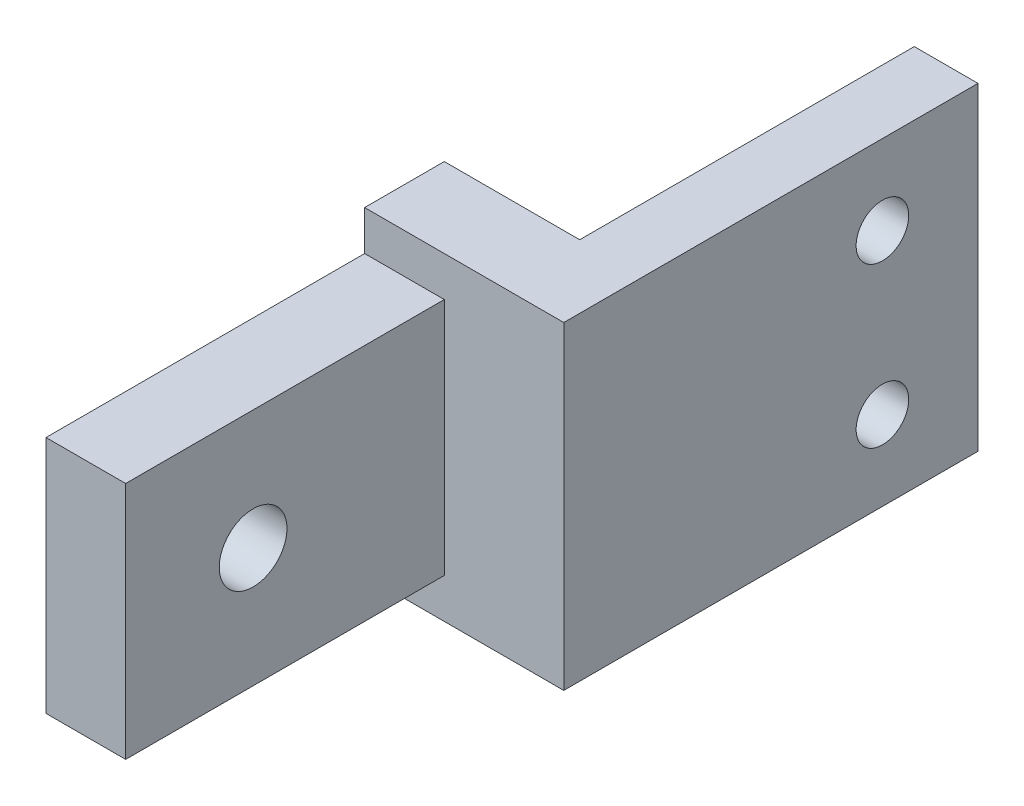
ISO-10303-21;
HEADER;
FILE_DESCRIPTION(('STEP AP214'),'2;1');
FILE_NAME('part.step','',(''),(''),'','','');
FILE_SCHEMA(('AUTOMOTIVE_DESIGN { 1 0 10303 214 1 1 1 1 }'));
ENDSEC;
DATA;
#1=APPLICATION_CONTEXT('core data for automotive mechanical design processes');
#2=APPLICATION_PROTOCOL_DEFINITION('international standard','automotive_design',2000,#1);
#3=PRODUCT_CONTEXT('',#1,'mechanical');
#4=PRODUCT('Part','Part','',(#3));
#5=PRODUCT_RELATED_PRODUCT_CATEGORY('part','',(#4));
#6=PRODUCT_DEFINITION_FORMATION('','',#4);
#7=PRODUCT_DEFINITION_CONTEXT('part definition',#1,'design');
#8=PRODUCT_DEFINITION('design','',#6,#7);
#9=PRODUCT_DEFINITION_SHAPE('','',#8);
#10=(LENGTH_UNIT() NAMED_UNIT(*) SI_UNIT(.MILLI.,.METRE.));
#11=(NAMED_UNIT(*) PLANE_ANGLE_UNIT() SI_UNIT($,.RADIAN.));
#12=(NAMED_UNIT(*) SI_UNIT($,.STERADIAN.) SOLID_ANGLE_UNIT());
#13=UNCERTAINTY_MEASURE_WITH_UNIT(LENGTH_MEASURE(1.E-05),#10,'distance_accuracy_value','');
#14=(GEOMETRIC_REPRESENTATION_CONTEXT(3) GLOBAL_UNCERTAINTY_ASSIGNED_CONTEXT((#13)) GLOBAL_UNIT_ASSIGNED_CONTEXT((#10,
#11,#12)) REPRESENTATION_CONTEXT('',''));
#15=CARTESIAN_POINT('',(0.,0.,0.));
#16=DIRECTION('',(0.,0.,1.));
#17=DIRECTION('',(1.,0.,0.));
#18=AXIS2_PLACEMENT_3D('',#15,#16,#17);
#19=CARTESIAN_POINT('',(0.003,5.,92.));
#20=DIRECTION('',(0.,0.,1.));
#21=DIRECTION('',(1.,0.,0.));
#22=AXIS2_PLACEMENT_3D('',#19,#20,#21);
#23=PLANE('',#22);
#24=DIRECTION('',(0.,1.,0.));
#25=VECTOR('',#24,1.);
#26=CARTESIAN_POINT('',(10.003,5.,92.));
#27=LINE('',#26,#25);
#28=CARTESIAN_POINT('',(10.003,35.,92.));
#29=VERTEX_POINT('',#28);
#30=CARTESIAN_POINT('',(10.003,5.,92.));
#31=VERTEX_POINT('',#30);
#32=EDGE_CURVE('E92',#29,#31,#27,.F.);
#33=ORIENTED_EDGE('',*,*,#32,.F.);
#34=DIRECTION('',(1.,0.,0.));
#35=VECTOR('',#34,1.);
#36=CARTESIAN_POINT('',(0.003,35.,92.));
#37=LINE('',#36,#35);
#38=CARTESIAN_POINT('',(0.003,35.,92.));
#39=VERTEX_POINT('',#38);
#40=EDGE_CURVE('E98',#39,#29,#37,.T.);
#41=ORIENTED_EDGE('',*,*,#40,.F.);
#42=DIRECTION('',(0.,1.,0.));
#43=VECTOR('',#42,1.);
#44=CARTESIAN_POINT('',(0.003,5.,92.));
#45=LINE('',#44,#43);
#46=CARTESIAN_POINT('',(0.003,5.,92.));
#47=VERTEX_POINT('',#46);
#48=EDGE_CURVE('E131',#39,#47,#45,.F.);
#49=ORIENTED_EDGE('',*,*,#48,.T.);
#50=DIRECTION('',(1.,0.,0.));
#51=VECTOR('',#50,1.);
#52=CARTESIAN_POINT('',(0.003,5.,92.));
#53=LINE('',#52,#51);
#54=EDGE_CURVE('E112',#47,#31,#53,.T.);
#55=ORIENTED_EDGE('',*,*,#54,.T.);
#56=EDGE_LOOP('',(#33,#41,#49,#55));
#57=FACE_BOUND('',#56,.T.);
#58=ADVANCED_FACE('F16',(#57),#23,.T.);
#59=CARTESIAN_POINT('',(0.003,20.,76.));
#60=DIRECTION('',(1.,0.,0.));
#61=DIRECTION('',(0.,0.,-1.));
#62=AXIS2_PLACEMENT_3D('',#59,#60,#61);
#63=CYLINDRICAL_SURFACE('',#62,4.25);
#64=CARTESIAN_POINT('',(0.003,20.,76.));
#65=DIRECTION('',(1.,0.,0.));
#66=DIRECTION('',(0.,0.,-1.));
#67=AXIS2_PLACEMENT_3D('',#64,#65,#66);
#68=CIRCLE('',#67,4.25);
#69=CARTESIAN_POINT('',(0.003,20.,71.75));
#70=VERTEX_POINT('',#69);
#71=EDGE_CURVE('E128',#70,#70,#68,.F.);
#72=ORIENTED_EDGE('',*,*,#71,.T.);
#73=EDGE_LOOP('',(#72));
#74=FACE_BOUND('',#73,.T.);
#75=CARTESIAN_POINT('',(10.003,20.,76.));
#76=DIRECTION('',(1.,0.,0.));
#77=DIRECTION('',(0.,0.,-1.));
#78=AXIS2_PLACEMENT_3D('',#75,#76,#77);
#79=CIRCLE('',#78,4.25);
#80=CARTESIAN_POINT('',(10.003,20.,71.75));
#81=VERTEX_POINT('',#80);
#82=EDGE_CURVE('E19',#81,#81,#79,.F.);
#83=ORIENTED_EDGE('',*,*,#82,.F.);
#84=EDGE_LOOP('',(#83));
#85=FACE_BOUND('',#84,.T.);
#86=ADVANCED_FACE('F342',(#74,#85),#63,.F.);
#87=CARTESIAN_POINT('',(0.003,35.,52.));
#88=DIRECTION('',(0.,1.,0.));
#89=DIRECTION('',(0.,0.,1.));
#90=AXIS2_PLACEMENT_3D('',#87,#88,#89);
#91=PLANE('',#90);
#92=ORIENTED_EDGE('',*,*,#40,.T.);
#93=DIRECTION('',(0.,0.,-1.));
#94=VECTOR('',#93,1.);
#95=CARTESIAN_POINT('',(10.003,35.,52.));
#96=LINE('',#95,#94);
#97=CARTESIAN_POINT('',(10.003,35.,52.));
#98=VERTEX_POINT('',#97);
#99=EDGE_CURVE('E101',#98,#29,#96,.F.);
#100=ORIENTED_EDGE('',*,*,#99,.F.);
#101=DIRECTION('',(1.,0.,0.));
#102=VECTOR('',#101,1.);
#103=CARTESIAN_POINT('',(0.003,35.,52.));
#104=LINE('',#103,#102);
#105=CARTESIAN_POINT('',(0.003,35.,52.));
#106=VERTEX_POINT('',#105);
#107=EDGE_CURVE('E130',#106,#98,#104,.T.);
#108=ORIENTED_EDGE('',*,*,#107,.F.);
#109=DIRECTION('',(0.,0.,-1.));
#110=VECTOR('',#109,1.);
#111=CARTESIAN_POINT('',(0.003,35.,52.));
#112=LINE('',#111,#110);
#113=EDGE_CURVE('E103',#106,#39,#112,.F.);
#114=ORIENTED_EDGE('',*,*,#113,.T.);
#115=EDGE_LOOP('',(#92,#100,#108,#114));
#116=FACE_BOUND('',#115,.T.);
#117=ADVANCED_FACE('F99',(#116),#91,.T.);
#118=CARTESIAN_POINT('',(10.003,5.,52.));
#119=DIRECTION('',(1.,0.,0.));
#120=DIRECTION('',(0.,0.,-1.));
#121=AXIS2_PLACEMENT_3D('',#118,#119,#120);
#122=PLANE('',#121);
#123=ORIENTED_EDGE('',*,*,#82,.T.);
#124=EDGE_LOOP('',(#123));
#125=FACE_BOUND('',#124,.T.);
#126=ORIENTED_EDGE('',*,*,#99,.T.);
#127=ORIENTED_EDGE('',*,*,#32,.T.);
#128=DIRECTION('',(0.,0.,1.));
#129=VECTOR('',#128,1.);
#130=CARTESIAN_POINT('',(10.003,5.,52.));
#131=LINE('',#130,#129);
#132=CARTESIAN_POINT('',(10.003,5.,52.));
#133=VERTEX_POINT('',#132);
#134=EDGE_CURVE('E141',#31,#133,#131,.F.);
#135=ORIENTED_EDGE('',*,*,#134,.T.);
#136=DIRECTION('',(0.,1.,0.));
#137=VECTOR('',#136,1.);
#138=CARTESIAN_POINT('',(10.003,0.,52.));
#139=LINE('',#138,#137);
#140=EDGE_CURVE('E109',#98,#133,#139,.F.);
#141=ORIENTED_EDGE('',*,*,#140,.F.);
#142=EDGE_LOOP('',(#126,#127,#135,#141));
#143=FACE_BOUND('',#142,.T.);
#144=ADVANCED_FACE('F108',(#125,#143),#122,.T.);
#145=CARTESIAN_POINT('',(0.003,5.,52.));
#146=DIRECTION('',(0.,1.,0.));
#147=DIRECTION('',(0.,0.,1.));
#148=AXIS2_PLACEMENT_3D('',#145,#146,#147);
#149=PLANE('',#148);
#150=ORIENTED_EDGE('',*,*,#54,.F.);
#151=DIRECTION('',(0.,0.,-1.));
#152=VECTOR('',#151,1.);
#153=CARTESIAN_POINT('',(0.003,5.,52.));
#154=LINE('',#153,#152);
#155=CARTESIAN_POINT('',(0.003,5.,52.));
#156=VERTEX_POINT('',#155);
#157=EDGE_CURVE('E136',#47,#156,#154,.T.);
#158=ORIENTED_EDGE('',*,*,#157,.T.);
#159=DIRECTION('',(1.,0.,0.));
#160=VECTOR('',#159,1.);
#161=CARTESIAN_POINT('',(0.003,5.,52.));
#162=LINE('',#161,#160);
#163=EDGE_CURVE('E144',#133,#156,#162,.F.);
#164=ORIENTED_EDGE('',*,*,#163,.F.);
#165=ORIENTED_EDGE('',*,*,#134,.F.);
#166=EDGE_LOOP('',(#150,#158,#164,#165));
#167=FACE_BOUND('',#166,.T.);
#168=ADVANCED_FACE('F145',(#167),#149,.F.);
#169=CARTESIAN_POINT('',(0.003,0.,52.));
#170=DIRECTION('',(0.,0.,1.));
#171=DIRECTION('',(1.,0.,0.));
#172=AXIS2_PLACEMENT_3D('',#169,#170,#171);
#173=PLANE('',#172);
#174=DIRECTION('',(1.,0.,0.));
#175=VECTOR('',#174,1.);
#176=CARTESIAN_POINT('',(0.003,0.,52.));
#177=LINE('',#176,#175);
#178=CARTESIAN_POINT('',(0.003,0.,52.));
#179=VERTEX_POINT('',#178);
#180=CARTESIAN_POINT('',(25.003,0.,52.));
#181=VERTEX_POINT('',#180);
#182=EDGE_CURVE('E167',#179,#181,#177,.T.);
#183=ORIENTED_EDGE('',*,*,#182,.T.);
#184=DIRECTION('',(0.,1.,0.));
#185=VECTOR('',#184,1.);
#186=CARTESIAN_POINT('',(25.003,0.,52.));
#187=LINE('',#186,#185);
#188=CARTESIAN_POINT('',(25.003,40.,52.));
#189=VERTEX_POINT('',#188);
#190=EDGE_CURVE('E149',#189,#181,#187,.F.);
#191=ORIENTED_EDGE('',*,*,#190,.F.);
#192=DIRECTION('',(1.,0.,0.));
#193=VECTOR('',#192,1.);
#194=CARTESIAN_POINT('',(0.003,40.,52.));
#195=LINE('',#194,#193);
#196=CARTESIAN_POINT('',(0.003,40.,52.));
#197=VERTEX_POINT('',#196);
#198=EDGE_CURVE('E152',#197,#189,#195,.T.);
#199=ORIENTED_EDGE('',*,*,#198,.F.);
#200=DIRECTION('',(0.,1.,0.));
#201=VECTOR('',#200,1.);
#202=CARTESIAN_POINT('',(0.003,0.,52.));
#203=LINE('',#202,#201);
#204=EDGE_CURVE('E159',#197,#106,#203,.F.);
#205=ORIENTED_EDGE('',*,*,#204,.T.);
#206=ORIENTED_EDGE('',*,*,#107,.T.);
#207=ORIENTED_EDGE('',*,*,#140,.T.);
#208=ORIENTED_EDGE('',*,*,#163,.T.);
#209=DIRECTION('',(0.,1.,0.));
#210=VECTOR('',#209,1.);
#211=CARTESIAN_POINT('',(0.003,0.,52.));
#212=LINE('',#211,#210);
#213=EDGE_CURVE('E162',#156,#179,#212,.F.);
#214=ORIENTED_EDGE('',*,*,#213,.T.);
#215=EDGE_LOOP('',(#183,#191,#199,#205,#206,#207,#208,#214));
#216=FACE_BOUND('',#215,.T.);
#217=ADVANCED_FACE('F219',(#216),#173,.T.);
#218=CARTESIAN_POINT('',(0.003,0.,42.));
#219=DIRECTION('',(1.,0.,0.));
#220=DIRECTION('',(0.,0.,-1.));
#221=AXIS2_PLACEMENT_3D('',#218,#219,#220);
#222=PLANE('',#221);
#223=ORIENTED_EDGE('',*,*,#213,.F.);
#224=ORIENTED_EDGE('',*,*,#157,.F.);
#225=ORIENTED_EDGE('',*,*,#48,.F.);
#226=ORIENTED_EDGE('',*,*,#113,.F.);
#227=ORIENTED_EDGE('',*,*,#204,.F.);
#228=DIRECTION('',(0.,0.,-1.));
#229=VECTOR('',#228,1.);
#230=CARTESIAN_POINT('',(0.003,40.,42.));
#231=LINE('',#230,#229);
#232=CARTESIAN_POINT('',(0.003,40.,42.));
#233=VERTEX_POINT('',#232);
#234=EDGE_CURVE('E156',#233,#197,#231,.F.);
#235=ORIENTED_EDGE('',*,*,#234,.F.);
#236=DIRECTION('',(0.,1.,0.));
#237=VECTOR('',#236,1.);
#238=CARTESIAN_POINT('',(0.003,0.,42.));
#239=LINE('',#238,#237);
#240=CARTESIAN_POINT('',(0.003,0.,42.));
#241=VERTEX_POINT('',#240);
#242=EDGE_CURVE('E182',#233,#241,#239,.F.);
#243=ORIENTED_EDGE('',*,*,#242,.T.);
#244=DIRECTION('',(0.,0.,1.));
#245=VECTOR('',#244,1.);
#246=CARTESIAN_POINT('',(0.003,0.,42.));
#247=LINE('',#246,#245);
#248=EDGE_CURVE('E164',#241,#179,#247,.T.);
#249=ORIENTED_EDGE('',*,*,#248,.T.);
#250=EDGE_LOOP('',(#223,#224,#225,#226,#227,#235,#243,#249));
#251=FACE_BOUND('',#250,.T.);
#252=ORIENTED_EDGE('',*,*,#71,.F.);
#253=EDGE_LOOP('',(#252));
#254=FACE_BOUND('',#253,.T.);
#255=ADVANCED_FACE('F213',(#251,#254),#222,.F.);
#256=CARTESIAN_POINT('',(25.003,0.,0.));
#257=DIRECTION('',(1.,0.,0.));
#258=DIRECTION('',(0.,0.,-1.));
#259=AXIS2_PLACEMENT_3D('',#256,#257,#258);
#260=PLANE('',#259);
#261=CARTESIAN_POINT('',(25.003,10.,12.));
#262=DIRECTION('',(1.,0.,0.));
#263=DIRECTION('',(0.,0.,-1.));
#264=AXIS2_PLACEMENT_3D('',#261,#262,#263);
#265=CIRCLE('',#264,3.3);
#266=CARTESIAN_POINT('',(25.003,10.,8.7));
#267=VERTEX_POINT('',#266);
#268=EDGE_CURVE('E121',#267,#267,#265,.F.);
#269=ORIENTED_EDGE('',*,*,#268,.T.);
#270=EDGE_LOOP('',(#269));
#271=FACE_BOUND('',#270,.T.);
#272=CARTESIAN_POINT('',(25.003,30.,12.));
#273=DIRECTION('',(1.,0.,0.));
#274=DIRECTION('',(0.,0.,-1.));
#275=AXIS2_PLACEMENT_3D('',#272,#273,#274);
#276=CIRCLE('',#275,3.3);
#277=CARTESIAN_POINT('',(25.003,30.,8.7));
#278=VERTEX_POINT('',#277);
#279=EDGE_CURVE('E125',#278,#278,#276,.F.);
#280=ORIENTED_EDGE('',*,*,#279,.T.);
#281=EDGE_LOOP('',(#280));
#282=FACE_BOUND('',#281,.T.);
#283=DIRECTION('',(0.,0.,1.));
#284=VECTOR('',#283,1.);
#285=CARTESIAN_POINT('',(25.003,40.,0.));
#286=LINE('',#285,#284);
#287=CARTESIAN_POINT('',(25.003,40.,0.));
#288=VERTEX_POINT('',#287);
#289=EDGE_CURVE('E177',#189,#288,#286,.F.);
#290=ORIENTED_EDGE('',*,*,#289,.F.);
#291=ORIENTED_EDGE('',*,*,#190,.T.);
#292=DIRECTION('',(0.,0.,1.));
#293=VECTOR('',#292,1.);
#294=CARTESIAN_POINT('',(25.003,0.,0.));
#295=LINE('',#294,#293);
#296=CARTESIAN_POINT('',(25.003,0.,0.));
#297=VERTEX_POINT('',#296);
#298=EDGE_CURVE('E169',#181,#297,#295,.F.);
#299=ORIENTED_EDGE('',*,*,#298,.T.);
#300=DIRECTION('',(0.,1.,0.));
#301=VECTOR('',#300,1.);
#302=CARTESIAN_POINT('',(25.003,0.,0.));
#303=LINE('',#302,#301);
#304=EDGE_CURVE('E174',#297,#288,#303,.T.);
#305=ORIENTED_EDGE('',*,*,#304,.T.);
#306=EDGE_LOOP('',(#290,#291,#299,#305));
#307=FACE_BOUND('',#306,.T.);
#308=ADVANCED_FACE('F218',(#271,#282,#307),#260,.T.);
#309=CARTESIAN_POINT('',(17.003,0.,0.));
#310=DIRECTION('',(0.,1.,0.));
#311=DIRECTION('',(0.,0.,1.));
#312=AXIS2_PLACEMENT_3D('',#309,#310,#311);
#313=PLANE('',#312);
#314=DIRECTION('',(0.,0.,-1.));
#315=VECTOR('',#314,1.);
#316=CARTESIAN_POINT('',(17.003,0.,0.));
#317=LINE('',#316,#315);
#318=CARTESIAN_POINT('',(17.003,0.,42.));
#319=VERTEX_POINT('',#318);
#320=CARTESIAN_POINT('',(17.003,0.,0.));
#321=VERTEX_POINT('',#320);
#322=EDGE_CURVE('E124',#319,#321,#317,.T.);
#323=ORIENTED_EDGE('',*,*,#322,.T.);
#324=DIRECTION('',(1.,0.,0.));
#325=VECTOR('',#324,1.);
#326=CARTESIAN_POINT('',(17.003,0.,0.));
#327=LINE('',#326,#325);
#328=EDGE_CURVE('E171',#321,#297,#327,.T.);
#329=ORIENTED_EDGE('',*,*,#328,.T.);
#330=ORIENTED_EDGE('',*,*,#298,.F.);
#331=ORIENTED_EDGE('',*,*,#182,.F.);
#332=ORIENTED_EDGE('',*,*,#248,.F.);
#333=DIRECTION('',(1.,0.,0.));
#334=VECTOR('',#333,1.);
#335=CARTESIAN_POINT('',(0.003,0.,42.));
#336=LINE('',#335,#334);
#337=EDGE_CURVE('E127',#241,#319,#336,.T.);
#338=ORIENTED_EDGE('',*,*,#337,.T.);
#339=EDGE_LOOP('',(#323,#329,#330,#331,#332,#338));
#340=FACE_BOUND('',#339,.T.);
#341=ADVANCED_FACE('F209',(#340),#313,.F.);
#342=CARTESIAN_POINT('',(17.003,0.,0.));
#343=DIRECTION('',(0.,0.,1.));
#344=DIRECTION('',(1.,0.,0.));
#345=AXIS2_PLACEMENT_3D('',#342,#343,#344);
#346=PLANE('',#345);
#347=ORIENTED_EDGE('',*,*,#304,.F.);
#348=ORIENTED_EDGE('',*,*,#328,.F.);
#349=DIRECTION('',(0.,1.,0.));
#350=VECTOR('',#349,1.);
#351=CARTESIAN_POINT('',(17.003,0.,0.));
#352=LINE('',#351,#350);
#353=CARTESIAN_POINT('',(17.003,40.,0.));
#354=VERTEX_POINT('',#353);
#355=EDGE_CURVE('E189',#321,#354,#352,.T.);
#356=ORIENTED_EDGE('',*,*,#355,.T.);
#357=DIRECTION('',(1.,0.,0.));
#358=VECTOR('',#357,1.);
#359=CARTESIAN_POINT('',(17.003,40.,0.));
#360=LINE('',#359,#358);
#361=EDGE_CURVE('E179',#288,#354,#360,.F.);
#362=ORIENTED_EDGE('',*,*,#361,.F.);
#363=EDGE_LOOP('',(#347,#348,#356,#362));
#364=FACE_BOUND('',#363,.T.);
#365=ADVANCED_FACE('F207',(#364),#346,.F.);
#366=CARTESIAN_POINT('',(17.003,40.,0.));
#367=DIRECTION('',(0.,1.,0.));
#368=DIRECTION('',(0.,0.,1.));
#369=AXIS2_PLACEMENT_3D('',#366,#367,#368);
#370=PLANE('',#369);
#371=DIRECTION('',(0.,0.,-1.));
#372=VECTOR('',#371,1.);
#373=CARTESIAN_POINT('',(17.003,40.,0.));
#374=LINE('',#373,#372);
#375=CARTESIAN_POINT('',(17.003,40.,42.));
#376=VERTEX_POINT('',#375);
#377=EDGE_CURVE('E192',#354,#376,#374,.F.);
#378=ORIENTED_EDGE('',*,*,#377,.T.);
#379=DIRECTION('',(1.,0.,0.));
#380=VECTOR('',#379,1.);
#381=CARTESIAN_POINT('',(0.003,40.,42.));
#382=LINE('',#381,#380);
#383=EDGE_CURVE('E34',#376,#233,#382,.F.);
#384=ORIENTED_EDGE('',*,*,#383,.T.);
#385=ORIENTED_EDGE('',*,*,#234,.T.);
#386=ORIENTED_EDGE('',*,*,#198,.T.);
#387=ORIENTED_EDGE('',*,*,#289,.T.);
#388=ORIENTED_EDGE('',*,*,#361,.T.);
#389=EDGE_LOOP('',(#378,#384,#385,#386,#387,#388));
#390=FACE_BOUND('',#389,.T.);
#391=ADVANCED_FACE('F202',(#390),#370,.T.);
#392=CARTESIAN_POINT('',(0.003,0.,42.));
#393=DIRECTION('',(0.,0.,1.));
#394=DIRECTION('',(1.,0.,0.));
#395=AXIS2_PLACEMENT_3D('',#392,#393,#394);
#396=PLANE('',#395);
#397=ORIENTED_EDGE('',*,*,#337,.F.);
#398=ORIENTED_EDGE('',*,*,#242,.F.);
#399=ORIENTED_EDGE('',*,*,#383,.F.);
#400=DIRECTION('',(0.,1.,0.));
#401=VECTOR('',#400,1.);
#402=CARTESIAN_POINT('',(17.003,0.,42.));
#403=LINE('',#402,#401);
#404=EDGE_CURVE('E120',#376,#319,#403,.F.);
#405=ORIENTED_EDGE('',*,*,#404,.T.);
#406=EDGE_LOOP('',(#397,#398,#399,#405));
#407=FACE_BOUND('',#406,.T.);
#408=ADVANCED_FACE('F196',(#407),#396,.F.);
#409=CARTESIAN_POINT('',(17.003,30.,12.));
#410=DIRECTION('',(1.,0.,0.));
#411=DIRECTION('',(0.,0.,-1.));
#412=AXIS2_PLACEMENT_3D('',#409,#410,#411);
#413=CYLINDRICAL_SURFACE('',#412,3.3);
#414=CARTESIAN_POINT('',(17.003,30.,12.));
#415=DIRECTION('',(1.,0.,0.));
#416=DIRECTION('',(0.,0.,-1.));
#417=AXIS2_PLACEMENT_3D('',#414,#415,#416);
#418=CIRCLE('',#417,3.3);
#419=CARTESIAN_POINT('',(17.003,30.,8.7));
#420=VERTEX_POINT('',#419);
#421=EDGE_CURVE('E25',#420,#420,#418,.F.);
#422=ORIENTED_EDGE('',*,*,#421,.T.);
#423=EDGE_LOOP('',(#422));
#424=FACE_BOUND('',#423,.T.);
#425=ORIENTED_EDGE('',*,*,#279,.F.);
#426=EDGE_LOOP('',(#425));
#427=FACE_BOUND('',#426,.T.);
#428=ADVANCED_FACE('F236',(#424,#427),#413,.F.);
#429=CARTESIAN_POINT('',(17.003,10.,12.));
#430=DIRECTION('',(1.,0.,0.));
#431=DIRECTION('',(0.,0.,-1.));
#432=AXIS2_PLACEMENT_3D('',#429,#430,#431);
#433=CYLINDRICAL_SURFACE('',#432,3.3);
#434=CARTESIAN_POINT('',(17.003,10.,12.));
#435=DIRECTION('',(1.,0.,0.));
#436=DIRECTION('',(0.,0.,-1.));
#437=AXIS2_PLACEMENT_3D('',#434,#435,#436);
#438=CIRCLE('',#437,3.3);
#439=CARTESIAN_POINT('',(17.003,10.,8.7));
#440=VERTEX_POINT('',#439);
#441=EDGE_CURVE('E11',#440,#440,#438,.F.);
#442=ORIENTED_EDGE('',*,*,#441,.T.);
#443=EDGE_LOOP('',(#442));
#444=FACE_BOUND('',#443,.T.);
#445=ORIENTED_EDGE('',*,*,#268,.F.);
#446=EDGE_LOOP('',(#445));
#447=FACE_BOUND('',#446,.T.);
#448=ADVANCED_FACE('F230',(#444,#447),#433,.F.);
#449=CARTESIAN_POINT('',(17.003,0.,0.));
#450=DIRECTION('',(1.,0.,0.));
#451=DIRECTION('',(0.,0.,-1.));
#452=AXIS2_PLACEMENT_3D('',#449,#450,#451);
#453=PLANE('',#452);
#454=ORIENTED_EDGE('',*,*,#441,.F.);
#455=EDGE_LOOP('',(#454));
#456=FACE_BOUND('',#455,.T.);
#457=ORIENTED_EDGE('',*,*,#421,.F.);
#458=EDGE_LOOP('',(#457));
#459=FACE_BOUND('',#458,.T.);
#460=ORIENTED_EDGE('',*,*,#377,.F.);
#461=ORIENTED_EDGE('',*,*,#355,.F.);
#462=ORIENTED_EDGE('',*,*,#322,.F.);
#463=ORIENTED_EDGE('',*,*,#404,.F.);
#464=EDGE_LOOP('',(#460,#461,#462,#463));
#465=FACE_BOUND('',#464,.T.);
#466=ADVANCED_FACE('F199',(#456,#459,#465),#453,.F.);
#467=CLOSED_SHELL('',(#58,#86,#117,#144,#168,#217,#255,#308,#341,#365,#391,#408,#428,#448,#466));
#468=MANIFOLD_SOLID_BREP('B1',#467);
#469=ADVANCED_BREP_SHAPE_REPRESENTATION('',(#18,#468),#14);
#470=SHAPE_DEFINITION_REPRESENTATION(#9,#469);
ENDSEC;
END-ISO-10303-21;
